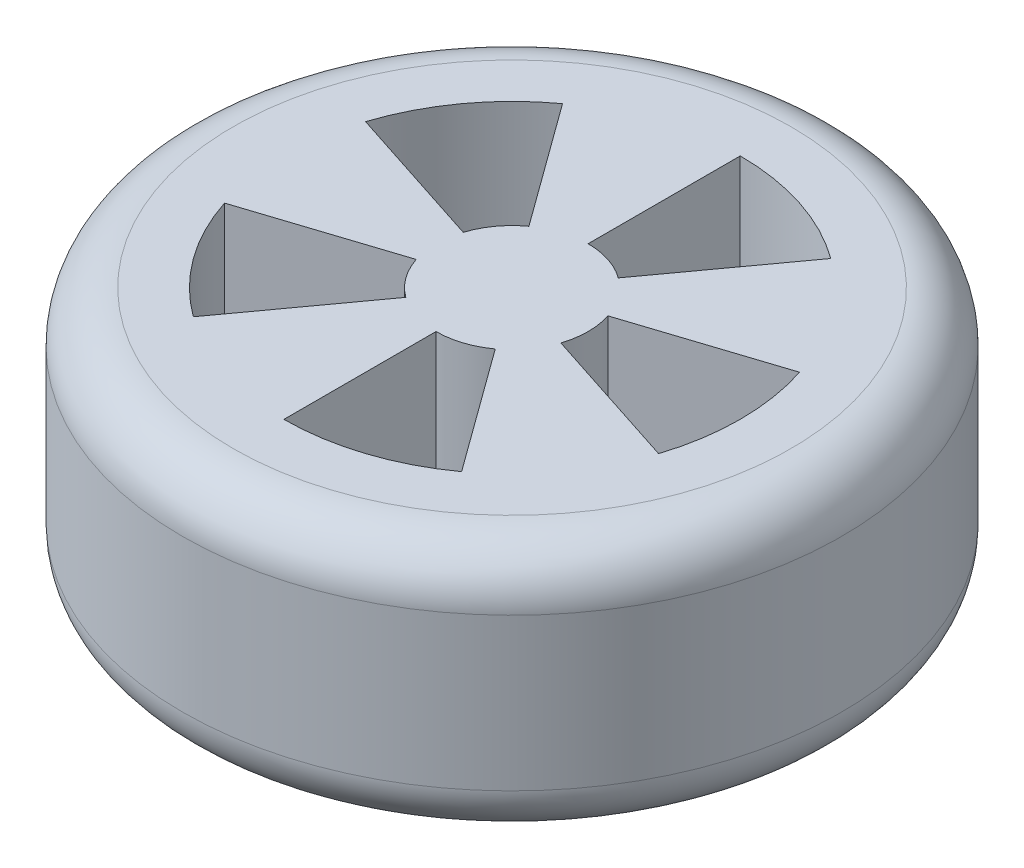
ISO-10303-21;
HEADER;
FILE_DESCRIPTION(('STEP AP214'),'2;1');
FILE_NAME('part.step','',(''),(''),'','','');
FILE_SCHEMA(('AUTOMOTIVE_DESIGN { 1 0 10303 214 1 1 1 1 }'));
ENDSEC;
DATA;
#1=APPLICATION_CONTEXT('core data for automotive mechanical design processes');
#2=APPLICATION_PROTOCOL_DEFINITION('international standard','automotive_design',2000,#1);
#3=PRODUCT_CONTEXT('',#1,'mechanical');
#4=PRODUCT('Part','Part','',(#3));
#5=PRODUCT_RELATED_PRODUCT_CATEGORY('part','',(#4));
#6=PRODUCT_DEFINITION_FORMATION('','',#4);
#7=PRODUCT_DEFINITION_CONTEXT('part definition',#1,'design');
#8=PRODUCT_DEFINITION('design','',#6,#7);
#9=PRODUCT_DEFINITION_SHAPE('','',#8);
#10=(LENGTH_UNIT() NAMED_UNIT(*) SI_UNIT(.MILLI.,.METRE.));
#11=(NAMED_UNIT(*) PLANE_ANGLE_UNIT() SI_UNIT($,.RADIAN.));
#12=(NAMED_UNIT(*) SI_UNIT($,.STERADIAN.) SOLID_ANGLE_UNIT());
#13=UNCERTAINTY_MEASURE_WITH_UNIT(LENGTH_MEASURE(1.E-05),#10,'distance_accuracy_value','');
#14=(GEOMETRIC_REPRESENTATION_CONTEXT(3) GLOBAL_UNCERTAINTY_ASSIGNED_CONTEXT((#13)) GLOBAL_UNIT_ASSIGNED_CONTEXT((#10,
#11,#12)) REPRESENTATION_CONTEXT('',''));
#15=CARTESIAN_POINT('',(0.,0.,0.));
#16=DIRECTION('',(0.,0.,1.));
#17=DIRECTION('',(1.,0.,0.));
#18=AXIS2_PLACEMENT_3D('',#15,#16,#17);
#19=CARTESIAN_POINT('',(0.,25.,0.));
#20=DIRECTION('',(0.,1.,0.));
#21=DIRECTION('',(0.,0.,1.));
#22=AXIS2_PLACEMENT_3D('',#19,#20,#21);
#23=PLANE('',#22);
#24=CARTESIAN_POINT('',(0.,25.,0.));
#25=DIRECTION('',(0.,1.,0.));
#26=DIRECTION('',(0.,0.,1.));
#27=AXIS2_PLACEMENT_3D('',#24,#25,#26);
#28=CIRCLE('',#27,27.5);
#29=CARTESIAN_POINT('',(0.,25.,27.5));
#30=VERTEX_POINT('',#29);
#31=EDGE_CURVE('E337',#30,#30,#28,.T.);
#32=ORIENTED_EDGE('',*,*,#31,.T.);
#33=EDGE_LOOP('',(#32));
#34=FACE_BOUND('',#33,.T.);
#35=DIRECTION('',(0.587785252292474,0.,-0.809016994374947));
#36=VECTOR('',#35,1.);
#37=CARTESIAN_POINT('',(4.40838939219354,25.,-6.06762745781211));
#38=LINE('',#37,#36);
#39=CARTESIAN_POINT('',(4.40838939219354,25.,-6.06762745781211));
#40=VERTEX_POINT('',#39);
#41=CARTESIAN_POINT('',(13.2251681765806,25.,-18.2028823734363));
#42=VERTEX_POINT('',#41);
#43=EDGE_CURVE('E309',#40,#42,#38,.T.);
#44=ORIENTED_EDGE('',*,*,#43,.F.);
#45=CARTESIAN_POINT('',(0.,25.,0.));
#46=DIRECTION('',(0.,-1.,0.));
#47=DIRECTION('',(0.,0.,1.));
#48=AXIS2_PLACEMENT_3D('',#45,#46,#47);
#49=CIRCLE('',#48,7.5);
#50=CARTESIAN_POINT('',(0.,25.,-7.5));
#51=VERTEX_POINT('',#50);
#52=EDGE_CURVE('E307',#51,#40,#49,.T.);
#53=ORIENTED_EDGE('',*,*,#52,.F.);
#54=DIRECTION('',(0.,0.,1.));
#55=VECTOR('',#54,1.);
#56=CARTESIAN_POINT('',(0.,25.,-7.5));
#57=LINE('',#56,#55);
#58=CARTESIAN_POINT('',(0.,25.,-22.5));
#59=VERTEX_POINT('',#58);
#60=EDGE_CURVE('E315',#59,#51,#57,.T.);
#61=ORIENTED_EDGE('',*,*,#60,.F.);
#62=CARTESIAN_POINT('',(0.,25.,0.));
#63=DIRECTION('',(0.,1.,0.));
#64=DIRECTION('',(0.,0.,1.));
#65=AXIS2_PLACEMENT_3D('',#62,#63,#64);
#66=CIRCLE('',#65,22.5);
#67=EDGE_CURVE('E312',#42,#59,#66,.T.);
#68=ORIENTED_EDGE('',*,*,#67,.F.);
#69=EDGE_LOOP('',(#44,#53,#61,#68));
#70=FACE_BOUND('',#69,.T.);
#71=DIRECTION('',(0.951056516295153,0.,0.309016994374948));
#72=VECTOR('',#71,1.);
#73=CARTESIAN_POINT('',(7.13292387221366,25.,2.31762745781209));
#74=LINE('',#73,#72);
#75=CARTESIAN_POINT('',(7.13292387221366,25.,2.31762745781209));
#76=VERTEX_POINT('',#75);
#77=CARTESIAN_POINT('',(21.398771616641,25.,6.95288237343632));
#78=VERTEX_POINT('',#77);
#79=EDGE_CURVE('E278',#76,#78,#74,.T.);
#80=ORIENTED_EDGE('',*,*,#79,.F.);
#81=CARTESIAN_POINT('',(0.,25.,0.));
#82=DIRECTION('',(0.,-1.,0.));
#83=DIRECTION('',(0.,0.,1.));
#84=AXIS2_PLACEMENT_3D('',#81,#82,#83);
#85=CIRCLE('',#84,7.5);
#86=CARTESIAN_POINT('',(7.13292387221365,25.,-2.31762745781212));
#87=VERTEX_POINT('',#86);
#88=EDGE_CURVE('E276',#87,#76,#85,.T.);
#89=ORIENTED_EDGE('',*,*,#88,.F.);
#90=DIRECTION('',(-0.951056516295154,0.,0.309016994374947));
#91=VECTOR('',#90,1.);
#92=CARTESIAN_POINT('',(7.13292387221365,25.,-2.31762745781212));
#93=LINE('',#92,#91);
#94=CARTESIAN_POINT('',(21.398771616641,25.,-6.95288237343632));
#95=VERTEX_POINT('',#94);
#96=EDGE_CURVE('E284',#95,#87,#93,.T.);
#97=ORIENTED_EDGE('',*,*,#96,.F.);
#98=CARTESIAN_POINT('',(0.,25.,0.));
#99=DIRECTION('',(0.,1.,0.));
#100=DIRECTION('',(0.,0.,1.));
#101=AXIS2_PLACEMENT_3D('',#98,#99,#100);
#102=CIRCLE('',#101,22.5);
#103=EDGE_CURVE('E281',#78,#95,#102,.T.);
#104=ORIENTED_EDGE('',*,*,#103,.F.);
#105=EDGE_LOOP('',(#80,#89,#97,#104));
#106=FACE_BOUND('',#105,.T.);
#107=DIRECTION('',(0.,0.,1.));
#108=VECTOR('',#107,1.);
#109=CARTESIAN_POINT('',(0.,25.,7.5));
#110=LINE('',#109,#108);
#111=CARTESIAN_POINT('',(0.,25.,7.5));
#112=VERTEX_POINT('',#111);
#113=CARTESIAN_POINT('',(0.,25.,22.5));
#114=VERTEX_POINT('',#113);
#115=EDGE_CURVE('E247',#112,#114,#110,.T.);
#116=ORIENTED_EDGE('',*,*,#115,.F.);
#117=CARTESIAN_POINT('',(0.,25.,0.));
#118=DIRECTION('',(0.,-1.,0.));
#119=DIRECTION('',(0.,0.,1.));
#120=AXIS2_PLACEMENT_3D('',#117,#118,#119);
#121=CIRCLE('',#120,7.5);
#122=CARTESIAN_POINT('',(4.40838939219356,25.,6.0676274578121));
#123=VERTEX_POINT('',#122);
#124=EDGE_CURVE('E245',#123,#112,#121,.T.);
#125=ORIENTED_EDGE('',*,*,#124,.F.);
#126=DIRECTION('',(-0.587785252292472,0.,-0.809016994374948));
#127=VECTOR('',#126,1.);
#128=CARTESIAN_POINT('',(4.40838939219356,25.,6.0676274578121));
#129=LINE('',#128,#127);
#130=CARTESIAN_POINT('',(13.2251681765806,25.,18.2028823734363));
#131=VERTEX_POINT('',#130);
#132=EDGE_CURVE('E253',#131,#123,#129,.T.);
#133=ORIENTED_EDGE('',*,*,#132,.F.);
#134=CARTESIAN_POINT('',(0.,25.,0.));
#135=DIRECTION('',(0.,1.,0.));
#136=DIRECTION('',(0.,0.,1.));
#137=AXIS2_PLACEMENT_3D('',#134,#135,#136);
#138=CIRCLE('',#137,22.5);
#139=EDGE_CURVE('E250',#114,#131,#138,.T.);
#140=ORIENTED_EDGE('',*,*,#139,.F.);
#141=EDGE_LOOP('',(#116,#125,#133,#140));
#142=FACE_BOUND('',#141,.T.);
#143=DIRECTION('',(-0.951056516295154,0.,0.309016994374947));
#144=VECTOR('',#143,1.);
#145=CARTESIAN_POINT('',(-7.13292387221365,25.,2.31762745781212));
#146=LINE('',#145,#144);
#147=CARTESIAN_POINT('',(-7.13292387221365,25.,2.31762745781212));
#148=VERTEX_POINT('',#147);
#149=CARTESIAN_POINT('',(-21.398771616641,25.,6.95288237343631));
#150=VERTEX_POINT('',#149);
#151=EDGE_CURVE('E216',#148,#150,#146,.T.);
#152=ORIENTED_EDGE('',*,*,#151,.F.);
#153=CARTESIAN_POINT('',(0.,25.,0.));
#154=DIRECTION('',(0.,-1.,0.));
#155=DIRECTION('',(0.,0.,1.));
#156=AXIS2_PLACEMENT_3D('',#153,#154,#155);
#157=CIRCLE('',#156,7.5);
#158=CARTESIAN_POINT('',(-4.40838939219354,25.,6.06762745781212));
#159=VERTEX_POINT('',#158);
#160=EDGE_CURVE('E214',#159,#148,#157,.T.);
#161=ORIENTED_EDGE('',*,*,#160,.F.);
#162=DIRECTION('',(0.587785252292474,0.,-0.809016994374947));
#163=VECTOR('',#162,1.);
#164=CARTESIAN_POINT('',(-4.40838939219354,25.,6.06762745781212));
#165=LINE('',#164,#163);
#166=CARTESIAN_POINT('',(-13.2251681765806,25.,18.2028823734363));
#167=VERTEX_POINT('',#166);
#168=EDGE_CURVE('E222',#167,#159,#165,.T.);
#169=ORIENTED_EDGE('',*,*,#168,.F.);
#170=CARTESIAN_POINT('',(0.,25.,0.));
#171=DIRECTION('',(0.,1.,0.));
#172=DIRECTION('',(0.,0.,1.));
#173=AXIS2_PLACEMENT_3D('',#170,#171,#172);
#174=CIRCLE('',#173,22.5);
#175=EDGE_CURVE('E219',#150,#167,#174,.T.);
#176=ORIENTED_EDGE('',*,*,#175,.F.);
#177=EDGE_LOOP('',(#152,#161,#169,#176));
#178=FACE_BOUND('',#177,.T.);
#179=DIRECTION('',(-0.587785252292473,0.,-0.809016994374947));
#180=VECTOR('',#179,1.);
#181=CARTESIAN_POINT('',(-4.40838939219355,25.,-6.0676274578121));
#182=LINE('',#181,#180);
#183=CARTESIAN_POINT('',(-4.40838939219355,25.,-6.0676274578121));
#184=VERTEX_POINT('',#183);
#185=CARTESIAN_POINT('',(-13.2251681765806,25.,-18.2028823734363));
#186=VERTEX_POINT('',#185);
#187=EDGE_CURVE('E186',#184,#186,#182,.T.);
#188=ORIENTED_EDGE('',*,*,#187,.F.);
#189=CARTESIAN_POINT('',(0.,25.,0.));
#190=DIRECTION('',(0.,-1.,0.));
#191=DIRECTION('',(0.,0.,1.));
#192=AXIS2_PLACEMENT_3D('',#189,#190,#191);
#193=CIRCLE('',#192,7.5);
#194=CARTESIAN_POINT('',(-7.13292387221365,25.,-2.31762745781213));
#195=VERTEX_POINT('',#194);
#196=EDGE_CURVE('E178',#195,#184,#193,.T.);
#197=ORIENTED_EDGE('',*,*,#196,.F.);
#198=DIRECTION('',(0.951056516295154,0.,0.309016994374947));
#199=VECTOR('',#198,1.);
#200=CARTESIAN_POINT('',(-7.13292387221365,25.,-2.31762745781213));
#201=LINE('',#200,#199);
#202=CARTESIAN_POINT('',(-21.3987716166409,25.,-6.95288237343633));
#203=VERTEX_POINT('',#202);
#204=EDGE_CURVE('E200',#203,#195,#201,.T.);
#205=ORIENTED_EDGE('',*,*,#204,.F.);
#206=CARTESIAN_POINT('',(0.,25.,0.));
#207=DIRECTION('',(0.,1.,0.));
#208=DIRECTION('',(0.,0.,1.));
#209=AXIS2_PLACEMENT_3D('',#206,#207,#208);
#210=CIRCLE('',#209,22.5);
#211=EDGE_CURVE('E198',#186,#203,#210,.T.);
#212=ORIENTED_EDGE('',*,*,#211,.F.);
#213=EDGE_LOOP('',(#188,#197,#205,#212));
#214=FACE_BOUND('',#213,.T.);
#215=ADVANCED_FACE('F41',(#34,#70,#106,#142,#178,#214),#23,.T.);
#216=CARTESIAN_POINT('',(0.,0.,0.));
#217=DIRECTION('',(0.,1.,0.));
#218=DIRECTION('',(0.,0.,1.));
#219=AXIS2_PLACEMENT_3D('',#216,#217,#218);
#220=PLANE('',#219);
#221=CARTESIAN_POINT('',(0.,0.,0.));
#222=DIRECTION('',(0.,1.,0.));
#223=DIRECTION('',(0.,0.,1.));
#224=AXIS2_PLACEMENT_3D('',#221,#222,#223);
#225=CIRCLE('',#224,27.5);
#226=CARTESIAN_POINT('',(0.,0.,27.5));
#227=VERTEX_POINT('',#226);
#228=EDGE_CURVE('E11',#227,#227,#225,.F.);
#229=ORIENTED_EDGE('',*,*,#228,.T.);
#230=EDGE_LOOP('',(#229));
#231=FACE_BOUND('',#230,.T.);
#232=CARTESIAN_POINT('',(0.,0.,0.));
#233=DIRECTION('',(0.,-1.,0.));
#234=DIRECTION('',(0.,0.,1.));
#235=AXIS2_PLACEMENT_3D('',#232,#233,#234);
#236=CIRCLE('',#235,7.5);
#237=CARTESIAN_POINT('',(-4.40838939219354,0.,6.06762745781212));
#238=VERTEX_POINT('',#237);
#239=CARTESIAN_POINT('',(-7.13292387221365,0.,2.31762745781212));
#240=VERTEX_POINT('',#239);
#241=EDGE_CURVE('E194',#238,#240,#236,.T.);
#242=ORIENTED_EDGE('',*,*,#241,.T.);
#243=DIRECTION('',(-0.951056516295154,0.,0.309016994374947));
#244=VECTOR('',#243,1.);
#245=CARTESIAN_POINT('',(-7.13292387221365,0.,2.31762745781212));
#246=LINE('',#245,#244);
#247=CARTESIAN_POINT('',(-21.398771616641,0.,6.95288237343631));
#248=VERTEX_POINT('',#247);
#249=EDGE_CURVE('E227',#240,#248,#246,.T.);
#250=ORIENTED_EDGE('',*,*,#249,.T.);
#251=CARTESIAN_POINT('',(0.,0.,0.));
#252=DIRECTION('',(0.,1.,0.));
#253=DIRECTION('',(0.,0.,1.));
#254=AXIS2_PLACEMENT_3D('',#251,#252,#253);
#255=CIRCLE('',#254,22.5);
#256=CARTESIAN_POINT('',(-13.2251681765806,0.,18.2028823734363));
#257=VERTEX_POINT('',#256);
#258=EDGE_CURVE('E230',#248,#257,#255,.T.);
#259=ORIENTED_EDGE('',*,*,#258,.T.);
#260=DIRECTION('',(0.587785252292474,0.,-0.809016994374947));
#261=VECTOR('',#260,1.);
#262=CARTESIAN_POINT('',(-4.40838939219354,0.,6.06762745781212));
#263=LINE('',#262,#261);
#264=EDGE_CURVE('E217',#257,#238,#263,.T.);
#265=ORIENTED_EDGE('',*,*,#264,.T.);
#266=EDGE_LOOP('',(#242,#250,#259,#265));
#267=FACE_BOUND('',#266,.T.);
#268=CARTESIAN_POINT('',(0.,0.,0.));
#269=DIRECTION('',(0.,-1.,0.));
#270=DIRECTION('',(0.,0.,1.));
#271=AXIS2_PLACEMENT_3D('',#268,#269,#270);
#272=CIRCLE('',#271,7.5);
#273=CARTESIAN_POINT('',(7.13292387221365,0.,-2.31762745781212));
#274=VERTEX_POINT('',#273);
#275=CARTESIAN_POINT('',(7.13292387221366,0.,2.31762745781209));
#276=VERTEX_POINT('',#275);
#277=EDGE_CURVE('E275',#274,#276,#272,.T.);
#278=ORIENTED_EDGE('',*,*,#277,.T.);
#279=DIRECTION('',(0.951056516295153,0.,0.309016994374948));
#280=VECTOR('',#279,1.);
#281=CARTESIAN_POINT('',(7.13292387221366,0.,2.31762745781209));
#282=LINE('',#281,#280);
#283=CARTESIAN_POINT('',(21.398771616641,0.,6.95288237343632));
#284=VERTEX_POINT('',#283);
#285=EDGE_CURVE('E289',#276,#284,#282,.T.);
#286=ORIENTED_EDGE('',*,*,#285,.T.);
#287=CARTESIAN_POINT('',(0.,0.,0.));
#288=DIRECTION('',(0.,1.,0.));
#289=DIRECTION('',(0.,0.,1.));
#290=AXIS2_PLACEMENT_3D('',#287,#288,#289);
#291=CIRCLE('',#290,22.5);
#292=CARTESIAN_POINT('',(21.398771616641,0.,-6.95288237343632));
#293=VERTEX_POINT('',#292);
#294=EDGE_CURVE('E292',#284,#293,#291,.T.);
#295=ORIENTED_EDGE('',*,*,#294,.T.);
#296=DIRECTION('',(-0.951056516295154,0.,0.309016994374947));
#297=VECTOR('',#296,1.);
#298=CARTESIAN_POINT('',(7.13292387221365,0.,-2.31762745781212));
#299=LINE('',#298,#297);
#300=EDGE_CURVE('E279',#293,#274,#299,.T.);
#301=ORIENTED_EDGE('',*,*,#300,.T.);
#302=EDGE_LOOP('',(#278,#286,#295,#301));
#303=FACE_BOUND('',#302,.T.);
#304=CARTESIAN_POINT('',(0.,0.,0.));
#305=DIRECTION('',(0.,-1.,0.));
#306=DIRECTION('',(0.,0.,1.));
#307=AXIS2_PLACEMENT_3D('',#304,#305,#306);
#308=CIRCLE('',#307,7.5);
#309=CARTESIAN_POINT('',(0.,0.,-7.5));
#310=VERTEX_POINT('',#309);
#311=CARTESIAN_POINT('',(4.40838939219354,0.,-6.06762745781211));
#312=VERTEX_POINT('',#311);
#313=EDGE_CURVE('E306',#310,#312,#308,.T.);
#314=ORIENTED_EDGE('',*,*,#313,.T.);
#315=DIRECTION('',(0.587785252292474,0.,-0.809016994374947));
#316=VECTOR('',#315,1.);
#317=CARTESIAN_POINT('',(4.40838939219354,0.,-6.06762745781211));
#318=LINE('',#317,#316);
#319=CARTESIAN_POINT('',(13.2251681765806,0.,-18.2028823734363));
#320=VERTEX_POINT('',#319);
#321=EDGE_CURVE('E320',#312,#320,#318,.T.);
#322=ORIENTED_EDGE('',*,*,#321,.T.);
#323=CARTESIAN_POINT('',(0.,0.,0.));
#324=DIRECTION('',(0.,1.,0.));
#325=DIRECTION('',(0.,0.,1.));
#326=AXIS2_PLACEMENT_3D('',#323,#324,#325);
#327=CIRCLE('',#326,22.5);
#328=CARTESIAN_POINT('',(0.,0.,-22.5));
#329=VERTEX_POINT('',#328);
#330=EDGE_CURVE('E323',#320,#329,#327,.T.);
#331=ORIENTED_EDGE('',*,*,#330,.T.);
#332=DIRECTION('',(0.,0.,1.));
#333=VECTOR('',#332,1.);
#334=CARTESIAN_POINT('',(0.,0.,-7.5));
#335=LINE('',#334,#333);
#336=EDGE_CURVE('E310',#329,#310,#335,.T.);
#337=ORIENTED_EDGE('',*,*,#336,.T.);
#338=EDGE_LOOP('',(#314,#322,#331,#337));
#339=FACE_BOUND('',#338,.T.);
#340=CARTESIAN_POINT('',(0.,0.,0.));
#341=DIRECTION('',(0.,-1.,0.));
#342=DIRECTION('',(0.,0.,1.));
#343=AXIS2_PLACEMENT_3D('',#340,#341,#342);
#344=CIRCLE('',#343,7.5);
#345=CARTESIAN_POINT('',(4.40838939219356,0.,6.0676274578121));
#346=VERTEX_POINT('',#345);
#347=CARTESIAN_POINT('',(0.,0.,7.5));
#348=VERTEX_POINT('',#347);
#349=EDGE_CURVE('E244',#346,#348,#344,.T.);
#350=ORIENTED_EDGE('',*,*,#349,.T.);
#351=DIRECTION('',(0.,0.,1.));
#352=VECTOR('',#351,1.);
#353=CARTESIAN_POINT('',(0.,0.,7.5));
#354=LINE('',#353,#352);
#355=CARTESIAN_POINT('',(0.,0.,22.5));
#356=VERTEX_POINT('',#355);
#357=EDGE_CURVE('E258',#348,#356,#354,.T.);
#358=ORIENTED_EDGE('',*,*,#357,.T.);
#359=CARTESIAN_POINT('',(0.,0.,0.));
#360=DIRECTION('',(0.,1.,0.));
#361=DIRECTION('',(0.,0.,1.));
#362=AXIS2_PLACEMENT_3D('',#359,#360,#361);
#363=CIRCLE('',#362,22.5);
#364=CARTESIAN_POINT('',(13.2251681765806,0.,18.2028823734363));
#365=VERTEX_POINT('',#364);
#366=EDGE_CURVE('E261',#356,#365,#363,.T.);
#367=ORIENTED_EDGE('',*,*,#366,.T.);
#368=DIRECTION('',(-0.587785252292472,0.,-0.809016994374948));
#369=VECTOR('',#368,1.);
#370=CARTESIAN_POINT('',(4.40838939219356,0.,6.0676274578121));
#371=LINE('',#370,#369);
#372=EDGE_CURVE('E248',#365,#346,#371,.T.);
#373=ORIENTED_EDGE('',*,*,#372,.T.);
#374=EDGE_LOOP('',(#350,#358,#367,#373));
#375=FACE_BOUND('',#374,.T.);
#376=CARTESIAN_POINT('',(0.,0.,0.));
#377=DIRECTION('',(0.,-1.,0.));
#378=DIRECTION('',(0.,0.,1.));
#379=AXIS2_PLACEMENT_3D('',#376,#377,#378);
#380=CIRCLE('',#379,7.5);
#381=CARTESIAN_POINT('',(-7.13292387221365,0.,-2.31762745781213));
#382=VERTEX_POINT('',#381);
#383=CARTESIAN_POINT('',(-4.40838939219355,0.,-6.0676274578121));
#384=VERTEX_POINT('',#383);
#385=EDGE_CURVE('E64',#382,#384,#380,.T.);
#386=ORIENTED_EDGE('',*,*,#385,.T.);
#387=DIRECTION('',(-0.587785252292473,0.,-0.809016994374947));
#388=VECTOR('',#387,1.);
#389=CARTESIAN_POINT('',(-4.40838939219355,0.,-6.0676274578121));
#390=LINE('',#389,#388);
#391=CARTESIAN_POINT('',(-13.2251681765806,0.,-18.2028823734363));
#392=VERTEX_POINT('',#391);
#393=EDGE_CURVE('E193',#384,#392,#390,.T.);
#394=ORIENTED_EDGE('',*,*,#393,.T.);
#395=CARTESIAN_POINT('',(0.,0.,0.));
#396=DIRECTION('',(0.,1.,0.));
#397=DIRECTION('',(0.,0.,1.));
#398=AXIS2_PLACEMENT_3D('',#395,#396,#397);
#399=CIRCLE('',#398,22.5);
#400=CARTESIAN_POINT('',(-21.3987716166409,0.,-6.95288237343633));
#401=VERTEX_POINT('',#400);
#402=EDGE_CURVE('E206',#392,#401,#399,.T.);
#403=ORIENTED_EDGE('',*,*,#402,.T.);
#404=DIRECTION('',(0.951056516295154,0.,0.309016994374947));
#405=VECTOR('',#404,1.);
#406=CARTESIAN_POINT('',(-7.13292387221365,0.,-2.31762745781213));
#407=LINE('',#406,#405);
#408=EDGE_CURVE('E187',#401,#382,#407,.T.);
#409=ORIENTED_EDGE('',*,*,#408,.T.);
#410=EDGE_LOOP('',(#386,#394,#403,#409));
#411=FACE_BOUND('',#410,.T.);
#412=ADVANCED_FACE('F359',(#231,#267,#303,#339,#375,#411),#220,.F.);
#413=CARTESIAN_POINT('',(0.,25.,0.));
#414=DIRECTION('',(0.,-1.,0.));
#415=DIRECTION('',(0.,0.,-1.));
#416=AXIS2_PLACEMENT_3D('',#413,#414,#415);
#417=CYLINDRICAL_SURFACE('',#416,32.5);
#418=CARTESIAN_POINT('',(0.,5.,0.));
#419=DIRECTION('',(0.,1.,0.));
#420=DIRECTION('',(0.,0.,1.));
#421=AXIS2_PLACEMENT_3D('',#418,#419,#420);
#422=CIRCLE('',#421,32.5);
#423=CARTESIAN_POINT('',(0.,5.,32.5));
#424=VERTEX_POINT('',#423);
#425=EDGE_CURVE('E49',#424,#424,#422,.T.);
#426=ORIENTED_EDGE('',*,*,#425,.T.);
#427=EDGE_LOOP('',(#426));
#428=FACE_BOUND('',#427,.T.);
#429=CARTESIAN_POINT('',(0.,20.,0.));
#430=DIRECTION('',(0.,1.,0.));
#431=DIRECTION('',(0.,0.,1.));
#432=AXIS2_PLACEMENT_3D('',#429,#430,#431);
#433=CIRCLE('',#432,32.5);
#434=CARTESIAN_POINT('',(0.,20.,32.5));
#435=VERTEX_POINT('',#434);
#436=EDGE_CURVE('E340',#435,#435,#433,.F.);
#437=ORIENTED_EDGE('',*,*,#436,.T.);
#438=EDGE_LOOP('',(#437));
#439=FACE_BOUND('',#438,.T.);
#440=ADVANCED_FACE('F345',(#428,#439),#417,.T.);
#441=CARTESIAN_POINT('',(0.,25.,0.));
#442=DIRECTION('',(0.,-1.,0.));
#443=DIRECTION('',(0.,0.,-1.));
#444=AXIS2_PLACEMENT_3D('',#441,#442,#443);
#445=CYLINDRICAL_SURFACE('',#444,7.5);
#446=ORIENTED_EDGE('',*,*,#313,.F.);
#447=DIRECTION('',(0.,-1.,0.));
#448=VECTOR('',#447,1.);
#449=CARTESIAN_POINT('',(0.,25.,-7.5));
#450=LINE('',#449,#448);
#451=EDGE_CURVE('E317',#51,#310,#450,.T.);
#452=ORIENTED_EDGE('',*,*,#451,.F.);
#453=ORIENTED_EDGE('',*,*,#52,.T.);
#454=DIRECTION('',(0.,-1.,0.));
#455=VECTOR('',#454,1.);
#456=CARTESIAN_POINT('',(4.40838939219354,25.,-6.06762745781211));
#457=LINE('',#456,#455);
#458=EDGE_CURVE('E334',#40,#312,#457,.T.);
#459=ORIENTED_EDGE('',*,*,#458,.T.);
#460=EDGE_LOOP('',(#446,#452,#453,#459));
#461=FACE_BOUND('',#460,.T.);
#462=ADVANCED_FACE('F370',(#461),#445,.T.);
#463=CARTESIAN_POINT('',(4.40838939219354,25.,-6.06762745781211));
#464=DIRECTION('',(-0.809016994374947,0.,-0.587785252292474));
#465=DIRECTION('',(-0.587785252292474,0.,0.809016994374947));
#466=AXIS2_PLACEMENT_3D('',#463,#464,#465);
#467=PLANE('',#466);
#468=ORIENTED_EDGE('',*,*,#321,.F.);
#469=ORIENTED_EDGE('',*,*,#458,.F.);
#470=ORIENTED_EDGE('',*,*,#43,.T.);
#471=DIRECTION('',(0.,-1.,0.));
#472=VECTOR('',#471,1.);
#473=CARTESIAN_POINT('',(13.2251681765806,25.,-18.2028823734363));
#474=LINE('',#473,#472);
#475=EDGE_CURVE('E332',#42,#320,#474,.T.);
#476=ORIENTED_EDGE('',*,*,#475,.T.);
#477=EDGE_LOOP('',(#468,#469,#470,#476));
#478=FACE_BOUND('',#477,.T.);
#479=ADVANCED_FACE('F376',(#478),#467,.T.);
#480=CARTESIAN_POINT('',(0.,25.,0.));
#481=DIRECTION('',(0.,-1.,0.));
#482=DIRECTION('',(0.,0.,-1.));
#483=AXIS2_PLACEMENT_3D('',#480,#481,#482);
#484=CYLINDRICAL_SURFACE('',#483,22.5);
#485=ORIENTED_EDGE('',*,*,#330,.F.);
#486=ORIENTED_EDGE('',*,*,#475,.F.);
#487=ORIENTED_EDGE('',*,*,#67,.T.);
#488=DIRECTION('',(0.,-1.,0.));
#489=VECTOR('',#488,1.);
#490=CARTESIAN_POINT('',(0.,25.,-22.5));
#491=LINE('',#490,#489);
#492=EDGE_CURVE('E330',#59,#329,#491,.T.);
#493=ORIENTED_EDGE('',*,*,#492,.T.);
#494=EDGE_LOOP('',(#485,#486,#487,#493));
#495=FACE_BOUND('',#494,.T.);
#496=ADVANCED_FACE('F381',(#495),#484,.F.);
#497=CARTESIAN_POINT('',(0.,25.,-7.5));
#498=DIRECTION('',(1.,0.,0.));
#499=DIRECTION('',(0.,0.,-1.));
#500=AXIS2_PLACEMENT_3D('',#497,#498,#499);
#501=PLANE('',#500);
#502=ORIENTED_EDGE('',*,*,#336,.F.);
#503=ORIENTED_EDGE('',*,*,#492,.F.);
#504=ORIENTED_EDGE('',*,*,#60,.T.);
#505=ORIENTED_EDGE('',*,*,#451,.T.);
#506=EDGE_LOOP('',(#502,#503,#504,#505));
#507=FACE_BOUND('',#506,.T.);
#508=ADVANCED_FACE('F389',(#507),#501,.T.);
#509=CARTESIAN_POINT('',(0.,25.,0.));
#510=DIRECTION('',(0.,-1.,0.));
#511=DIRECTION('',(0.,0.,-1.));
#512=AXIS2_PLACEMENT_3D('',#509,#510,#511);
#513=CYLINDRICAL_SURFACE('',#512,7.5);
#514=ORIENTED_EDGE('',*,*,#277,.F.);
#515=DIRECTION('',(0.,-1.,0.));
#516=VECTOR('',#515,1.);
#517=CARTESIAN_POINT('',(7.13292387221365,25.,-2.31762745781212));
#518=LINE('',#517,#516);
#519=EDGE_CURVE('E286',#87,#274,#518,.T.);
#520=ORIENTED_EDGE('',*,*,#519,.F.);
#521=ORIENTED_EDGE('',*,*,#88,.T.);
#522=DIRECTION('',(0.,-1.,0.));
#523=VECTOR('',#522,1.);
#524=CARTESIAN_POINT('',(7.13292387221366,25.,2.31762745781209));
#525=LINE('',#524,#523);
#526=EDGE_CURVE('E303',#76,#276,#525,.T.);
#527=ORIENTED_EDGE('',*,*,#526,.T.);
#528=EDGE_LOOP('',(#514,#520,#521,#527));
#529=FACE_BOUND('',#528,.T.);
#530=ADVANCED_FACE('F466',(#529),#513,.T.);
#531=CARTESIAN_POINT('',(7.13292387221366,25.,2.31762745781209));
#532=DIRECTION('',(0.309016994374948,0.,-0.951056516295153));
#533=DIRECTION('',(-0.951056516295153,0.,-0.309016994374948));
#534=AXIS2_PLACEMENT_3D('',#531,#532,#533);
#535=PLANE('',#534);
#536=ORIENTED_EDGE('',*,*,#285,.F.);
#537=ORIENTED_EDGE('',*,*,#526,.F.);
#538=ORIENTED_EDGE('',*,*,#79,.T.);
#539=DIRECTION('',(0.,-1.,0.));
#540=VECTOR('',#539,1.);
#541=CARTESIAN_POINT('',(21.398771616641,25.,6.95288237343632));
#542=LINE('',#541,#540);
#543=EDGE_CURVE('E301',#78,#284,#542,.T.);
#544=ORIENTED_EDGE('',*,*,#543,.T.);
#545=EDGE_LOOP('',(#536,#537,#538,#544));
#546=FACE_BOUND('',#545,.T.);
#547=ADVANCED_FACE('F462',(#546),#535,.T.);
#548=CARTESIAN_POINT('',(0.,25.,0.));
#549=DIRECTION('',(0.,-1.,0.));
#550=DIRECTION('',(0.,0.,-1.));
#551=AXIS2_PLACEMENT_3D('',#548,#549,#550);
#552=CYLINDRICAL_SURFACE('',#551,22.5);
#553=ORIENTED_EDGE('',*,*,#294,.F.);
#554=ORIENTED_EDGE('',*,*,#543,.F.);
#555=ORIENTED_EDGE('',*,*,#103,.T.);
#556=DIRECTION('',(0.,-1.,0.));
#557=VECTOR('',#556,1.);
#558=CARTESIAN_POINT('',(21.398771616641,25.,-6.95288237343632));
#559=LINE('',#558,#557);
#560=EDGE_CURVE('E299',#95,#293,#559,.T.);
#561=ORIENTED_EDGE('',*,*,#560,.T.);
#562=EDGE_LOOP('',(#553,#554,#555,#561));
#563=FACE_BOUND('',#562,.T.);
#564=ADVANCED_FACE('F458',(#563),#552,.F.);
#565=CARTESIAN_POINT('',(7.13292387221365,25.,-2.31762745781212));
#566=DIRECTION('',(0.309016994374947,0.,0.951056516295154));
#567=DIRECTION('',(0.951056516295154,0.,-0.309016994374947));
#568=AXIS2_PLACEMENT_3D('',#565,#566,#567);
#569=PLANE('',#568);
#570=ORIENTED_EDGE('',*,*,#300,.F.);
#571=ORIENTED_EDGE('',*,*,#560,.F.);
#572=ORIENTED_EDGE('',*,*,#96,.T.);
#573=ORIENTED_EDGE('',*,*,#519,.T.);
#574=EDGE_LOOP('',(#570,#571,#572,#573));
#575=FACE_BOUND('',#574,.T.);
#576=ADVANCED_FACE('F454',(#575),#569,.T.);
#577=CARTESIAN_POINT('',(0.,25.,0.));
#578=DIRECTION('',(0.,-1.,0.));
#579=DIRECTION('',(0.,0.,-1.));
#580=AXIS2_PLACEMENT_3D('',#577,#578,#579);
#581=CYLINDRICAL_SURFACE('',#580,7.5);
#582=ORIENTED_EDGE('',*,*,#349,.F.);
#583=DIRECTION('',(0.,-1.,0.));
#584=VECTOR('',#583,1.);
#585=CARTESIAN_POINT('',(4.40838939219356,25.,6.0676274578121));
#586=LINE('',#585,#584);
#587=EDGE_CURVE('E255',#123,#346,#586,.T.);
#588=ORIENTED_EDGE('',*,*,#587,.F.);
#589=ORIENTED_EDGE('',*,*,#124,.T.);
#590=DIRECTION('',(0.,-1.,0.));
#591=VECTOR('',#590,1.);
#592=CARTESIAN_POINT('',(0.,25.,7.5));
#593=LINE('',#592,#591);
#594=EDGE_CURVE('E272',#112,#348,#593,.T.);
#595=ORIENTED_EDGE('',*,*,#594,.T.);
#596=EDGE_LOOP('',(#582,#588,#589,#595));
#597=FACE_BOUND('',#596,.T.);
#598=ADVANCED_FACE('F450',(#597),#581,.T.);
#599=CARTESIAN_POINT('',(0.,25.,7.5));
#600=DIRECTION('',(1.,0.,0.));
#601=DIRECTION('',(0.,0.,-1.));
#602=AXIS2_PLACEMENT_3D('',#599,#600,#601);
#603=PLANE('',#602);
#604=ORIENTED_EDGE('',*,*,#357,.F.);
#605=ORIENTED_EDGE('',*,*,#594,.F.);
#606=ORIENTED_EDGE('',*,*,#115,.T.);
#607=DIRECTION('',(0.,-1.,0.));
#608=VECTOR('',#607,1.);
#609=CARTESIAN_POINT('',(0.,25.,22.5));
#610=LINE('',#609,#608);
#611=EDGE_CURVE('E270',#114,#356,#610,.T.);
#612=ORIENTED_EDGE('',*,*,#611,.T.);
#613=EDGE_LOOP('',(#604,#605,#606,#612));
#614=FACE_BOUND('',#613,.T.);
#615=ADVANCED_FACE('F446',(#614),#603,.T.);
#616=CARTESIAN_POINT('',(0.,25.,0.));
#617=DIRECTION('',(0.,-1.,0.));
#618=DIRECTION('',(0.,0.,-1.));
#619=AXIS2_PLACEMENT_3D('',#616,#617,#618);
#620=CYLINDRICAL_SURFACE('',#619,22.5);
#621=ORIENTED_EDGE('',*,*,#366,.F.);
#622=ORIENTED_EDGE('',*,*,#611,.F.);
#623=ORIENTED_EDGE('',*,*,#139,.T.);
#624=DIRECTION('',(0.,-1.,0.));
#625=VECTOR('',#624,1.);
#626=CARTESIAN_POINT('',(13.2251681765806,25.,18.2028823734363));
#627=LINE('',#626,#625);
#628=EDGE_CURVE('E268',#131,#365,#627,.T.);
#629=ORIENTED_EDGE('',*,*,#628,.T.);
#630=EDGE_LOOP('',(#621,#622,#623,#629));
#631=FACE_BOUND('',#630,.T.);
#632=ADVANCED_FACE('F442',(#631),#620,.F.);
#633=CARTESIAN_POINT('',(4.40838939219356,25.,6.0676274578121));
#634=DIRECTION('',(-0.809016994374948,0.,0.587785252292472));
#635=DIRECTION('',(0.587785252292472,0.,0.809016994374948));
#636=AXIS2_PLACEMENT_3D('',#633,#634,#635);
#637=PLANE('',#636);
#638=ORIENTED_EDGE('',*,*,#372,.F.);
#639=ORIENTED_EDGE('',*,*,#628,.F.);
#640=ORIENTED_EDGE('',*,*,#132,.T.);
#641=ORIENTED_EDGE('',*,*,#587,.T.);
#642=EDGE_LOOP('',(#638,#639,#640,#641));
#643=FACE_BOUND('',#642,.T.);
#644=ADVANCED_FACE('F439',(#643),#637,.T.);
#645=CARTESIAN_POINT('',(0.,25.,0.));
#646=DIRECTION('',(0.,-1.,0.));
#647=DIRECTION('',(0.,0.,-1.));
#648=AXIS2_PLACEMENT_3D('',#645,#646,#647);
#649=CYLINDRICAL_SURFACE('',#648,7.5);
#650=ORIENTED_EDGE('',*,*,#241,.F.);
#651=DIRECTION('',(0.,-1.,0.));
#652=VECTOR('',#651,1.);
#653=CARTESIAN_POINT('',(-4.40838939219354,25.,6.06762745781212));
#654=LINE('',#653,#652);
#655=EDGE_CURVE('E224',#159,#238,#654,.T.);
#656=ORIENTED_EDGE('',*,*,#655,.F.);
#657=ORIENTED_EDGE('',*,*,#160,.T.);
#658=DIRECTION('',(0.,-1.,0.));
#659=VECTOR('',#658,1.);
#660=CARTESIAN_POINT('',(-7.13292387221365,25.,2.31762745781212));
#661=LINE('',#660,#659);
#662=EDGE_CURVE('E241',#148,#240,#661,.T.);
#663=ORIENTED_EDGE('',*,*,#662,.T.);
#664=EDGE_LOOP('',(#650,#656,#657,#663));
#665=FACE_BOUND('',#664,.T.);
#666=ADVANCED_FACE('F421',(#665),#649,.T.);
#667=CARTESIAN_POINT('',(-7.13292387221365,25.,2.31762745781212));
#668=DIRECTION('',(0.309016994374947,0.,0.951056516295154));
#669=DIRECTION('',(0.951056516295154,0.,-0.309016994374947));
#670=AXIS2_PLACEMENT_3D('',#667,#668,#669);
#671=PLANE('',#670);
#672=ORIENTED_EDGE('',*,*,#249,.F.);
#673=ORIENTED_EDGE('',*,*,#662,.F.);
#674=ORIENTED_EDGE('',*,*,#151,.T.);
#675=DIRECTION('',(0.,-1.,0.));
#676=VECTOR('',#675,1.);
#677=CARTESIAN_POINT('',(-21.398771616641,25.,6.95288237343631));
#678=LINE('',#677,#676);
#679=EDGE_CURVE('E239',#150,#248,#678,.T.);
#680=ORIENTED_EDGE('',*,*,#679,.T.);
#681=EDGE_LOOP('',(#672,#673,#674,#680));
#682=FACE_BOUND('',#681,.T.);
#683=ADVANCED_FACE('F413',(#682),#671,.T.);
#684=CARTESIAN_POINT('',(0.,25.,0.));
#685=DIRECTION('',(0.,-1.,0.));
#686=DIRECTION('',(0.,0.,-1.));
#687=AXIS2_PLACEMENT_3D('',#684,#685,#686);
#688=CYLINDRICAL_SURFACE('',#687,22.5);
#689=ORIENTED_EDGE('',*,*,#258,.F.);
#690=ORIENTED_EDGE('',*,*,#679,.F.);
#691=ORIENTED_EDGE('',*,*,#175,.T.);
#692=DIRECTION('',(0.,-1.,0.));
#693=VECTOR('',#692,1.);
#694=CARTESIAN_POINT('',(-13.2251681765806,25.,18.2028823734363));
#695=LINE('',#694,#693);
#696=EDGE_CURVE('E237',#167,#257,#695,.T.);
#697=ORIENTED_EDGE('',*,*,#696,.T.);
#698=EDGE_LOOP('',(#689,#690,#691,#697));
#699=FACE_BOUND('',#698,.T.);
#700=ADVANCED_FACE('F416',(#699),#688,.F.);
#701=CARTESIAN_POINT('',(-4.40838939219354,25.,6.06762745781212));
#702=DIRECTION('',(-0.809016994374947,0.,-0.587785252292474));
#703=DIRECTION('',(-0.587785252292474,0.,0.809016994374947));
#704=AXIS2_PLACEMENT_3D('',#701,#702,#703);
#705=PLANE('',#704);
#706=ORIENTED_EDGE('',*,*,#264,.F.);
#707=ORIENTED_EDGE('',*,*,#696,.F.);
#708=ORIENTED_EDGE('',*,*,#168,.T.);
#709=ORIENTED_EDGE('',*,*,#655,.T.);
#710=EDGE_LOOP('',(#706,#707,#708,#709));
#711=FACE_BOUND('',#710,.T.);
#712=ADVANCED_FACE('F424',(#711),#705,.T.);
#713=CARTESIAN_POINT('',(0.,25.,0.));
#714=DIRECTION('',(0.,-1.,0.));
#715=DIRECTION('',(0.,0.,-1.));
#716=AXIS2_PLACEMENT_3D('',#713,#714,#715);
#717=CYLINDRICAL_SURFACE('',#716,7.5);
#718=ORIENTED_EDGE('',*,*,#385,.F.);
#719=DIRECTION('',(0.,-1.,0.));
#720=VECTOR('',#719,1.);
#721=CARTESIAN_POINT('',(-7.13292387221365,25.,-2.31762745781213));
#722=LINE('',#721,#720);
#723=EDGE_CURVE('E182',#195,#382,#722,.T.);
#724=ORIENTED_EDGE('',*,*,#723,.F.);
#725=ORIENTED_EDGE('',*,*,#196,.T.);
#726=DIRECTION('',(0.,-1.,0.));
#727=VECTOR('',#726,1.);
#728=CARTESIAN_POINT('',(-4.40838939219355,25.,-6.0676274578121));
#729=LINE('',#728,#727);
#730=EDGE_CURVE('E181',#184,#384,#729,.T.);
#731=ORIENTED_EDGE('',*,*,#730,.T.);
#732=EDGE_LOOP('',(#718,#724,#725,#731));
#733=FACE_BOUND('',#732,.T.);
#734=ADVANCED_FACE('F180',(#733),#717,.T.);
#735=CARTESIAN_POINT('',(-4.40838939219355,25.,-6.0676274578121));
#736=DIRECTION('',(-0.809016994374947,0.,0.587785252292473));
#737=DIRECTION('',(0.587785252292473,0.,0.809016994374947));
#738=AXIS2_PLACEMENT_3D('',#735,#736,#737);
#739=PLANE('',#738);
#740=ORIENTED_EDGE('',*,*,#393,.F.);
#741=ORIENTED_EDGE('',*,*,#730,.F.);
#742=ORIENTED_EDGE('',*,*,#187,.T.);
#743=DIRECTION('',(0.,-1.,0.));
#744=VECTOR('',#743,1.);
#745=CARTESIAN_POINT('',(-13.2251681765806,25.,-18.2028823734363));
#746=LINE('',#745,#744);
#747=EDGE_CURVE('E195',#186,#392,#746,.T.);
#748=ORIENTED_EDGE('',*,*,#747,.T.);
#749=EDGE_LOOP('',(#740,#741,#742,#748));
#750=FACE_BOUND('',#749,.T.);
#751=ADVANCED_FACE('F190',(#750),#739,.T.);
#752=CARTESIAN_POINT('',(0.,25.,0.));
#753=DIRECTION('',(0.,-1.,0.));
#754=DIRECTION('',(0.,0.,-1.));
#755=AXIS2_PLACEMENT_3D('',#752,#753,#754);
#756=CYLINDRICAL_SURFACE('',#755,22.5);
#757=ORIENTED_EDGE('',*,*,#402,.F.);
#758=ORIENTED_EDGE('',*,*,#747,.F.);
#759=ORIENTED_EDGE('',*,*,#211,.T.);
#760=DIRECTION('',(0.,-1.,0.));
#761=VECTOR('',#760,1.);
#762=CARTESIAN_POINT('',(-21.3987716166409,25.,-6.95288237343633));
#763=LINE('',#762,#761);
#764=EDGE_CURVE('E56',#203,#401,#763,.T.);
#765=ORIENTED_EDGE('',*,*,#764,.T.);
#766=EDGE_LOOP('',(#757,#758,#759,#765));
#767=FACE_BOUND('',#766,.T.);
#768=ADVANCED_FACE('F558',(#767),#756,.F.);
#769=CARTESIAN_POINT('',(-7.13292387221365,25.,-2.31762745781213));
#770=DIRECTION('',(0.309016994374947,0.,-0.951056516295154));
#771=DIRECTION('',(-0.951056516295154,0.,-0.309016994374947));
#772=AXIS2_PLACEMENT_3D('',#769,#770,#771);
#773=PLANE('',#772);
#774=ORIENTED_EDGE('',*,*,#408,.F.);
#775=ORIENTED_EDGE('',*,*,#764,.F.);
#776=ORIENTED_EDGE('',*,*,#204,.T.);
#777=ORIENTED_EDGE('',*,*,#723,.T.);
#778=EDGE_LOOP('',(#774,#775,#776,#777));
#779=FACE_BOUND('',#778,.T.);
#780=ADVANCED_FACE('F355',(#779),#773,.T.);
#781=CARTESIAN_POINT('',(0.,20.,0.));
#782=DIRECTION('',(0.,1.,0.));
#783=DIRECTION('',(0.,0.,1.));
#784=AXIS2_PLACEMENT_3D('',#781,#782,#783);
#785=TOROIDAL_SURFACE('',#784,27.5,5.);
#786=ORIENTED_EDGE('',*,*,#436,.F.);
#787=EDGE_LOOP('',(#786));
#788=FACE_BOUND('',#787,.T.);
#789=ORIENTED_EDGE('',*,*,#31,.F.);
#790=EDGE_LOOP('',(#789));
#791=FACE_BOUND('',#790,.T.);
#792=ADVANCED_FACE('F349',(#788,#791),#785,.T.);
#793=CARTESIAN_POINT('',(0.,5.,0.));
#794=DIRECTION('',(0.,1.,0.));
#795=DIRECTION('',(0.,0.,1.));
#796=AXIS2_PLACEMENT_3D('',#793,#794,#795);
#797=TOROIDAL_SURFACE('',#796,27.5,5.);
#798=ORIENTED_EDGE('',*,*,#228,.F.);
#799=EDGE_LOOP('',(#798));
#800=FACE_BOUND('',#799,.T.);
#801=ORIENTED_EDGE('',*,*,#425,.F.);
#802=EDGE_LOOP('',(#801));
#803=FACE_BOUND('',#802,.T.);
#804=ADVANCED_FACE('F43',(#800,#803),#797,.T.);
#805=CLOSED_SHELL('',(#215,#412,#440,#462,#479,#496,#508,#530,#547,#564,#576,#598,#615,#632,
#644,#666,#683,#700,#712,#734,#751,#768,#780,#792,#804));
#806=MANIFOLD_SOLID_BREP('B2',#805);
#807=ADVANCED_BREP_SHAPE_REPRESENTATION('',(#18,#806),#14);
#808=SHAPE_DEFINITION_REPRESENTATION(#9,#807);
ENDSEC;
END-ISO-10303-21;
